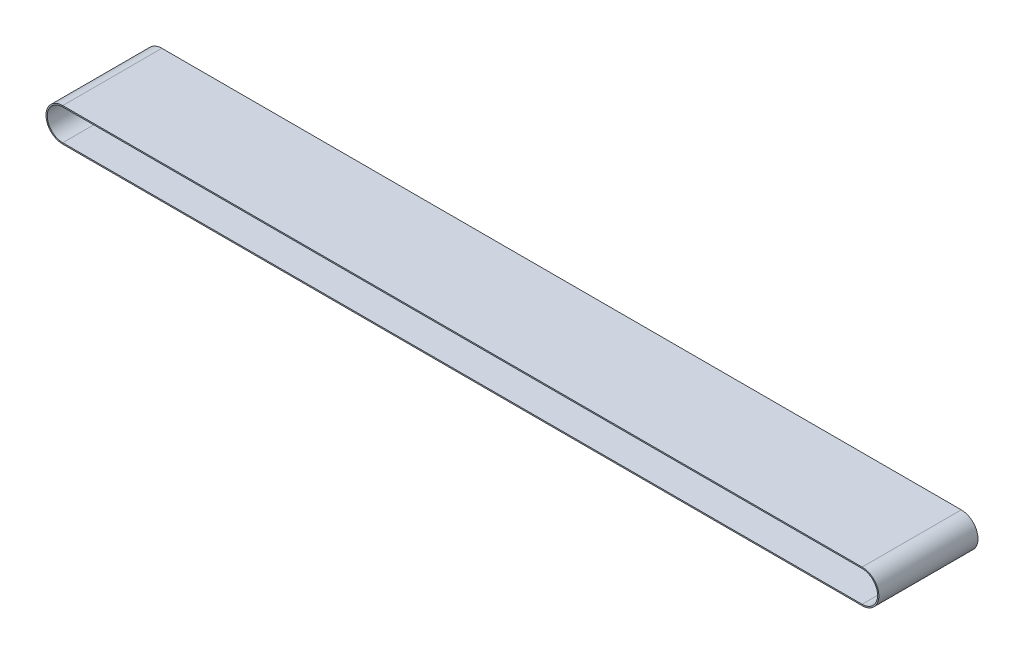
ISO-10303-21;
HEADER;
FILE_DESCRIPTION(('STEP AP214'),'2;1');
FILE_NAME('part.step','',(''),(''),'','','');
FILE_SCHEMA(('AUTOMOTIVE_DESIGN { 1 0 10303 214 1 1 1 1 }'));
ENDSEC;
DATA;
#1=APPLICATION_CONTEXT('core data for automotive mechanical design processes');
#2=APPLICATION_PROTOCOL_DEFINITION('international standard','automotive_design',2000,#1);
#3=PRODUCT_CONTEXT('',#1,'mechanical');
#4=PRODUCT('Part','Part','',(#3));
#5=PRODUCT_RELATED_PRODUCT_CATEGORY('part','',(#4));
#6=PRODUCT_DEFINITION_FORMATION('','',#4);
#7=PRODUCT_DEFINITION_CONTEXT('part definition',#1,'design');
#8=PRODUCT_DEFINITION('design','',#6,#7);
#9=PRODUCT_DEFINITION_SHAPE('','',#8);
#10=(LENGTH_UNIT() NAMED_UNIT(*) SI_UNIT(.MILLI.,.METRE.));
#11=(NAMED_UNIT(*) PLANE_ANGLE_UNIT() SI_UNIT($,.RADIAN.));
#12=(NAMED_UNIT(*) SI_UNIT($,.STERADIAN.) SOLID_ANGLE_UNIT());
#13=UNCERTAINTY_MEASURE_WITH_UNIT(LENGTH_MEASURE(1.E-05),#10,'distance_accuracy_value','');
#14=(GEOMETRIC_REPRESENTATION_CONTEXT(3) GLOBAL_UNCERTAINTY_ASSIGNED_CONTEXT((#13)) GLOBAL_UNIT_ASSIGNED_CONTEXT((#10,
#11,#12)) REPRESENTATION_CONTEXT('',''));
#15=CARTESIAN_POINT('',(0.,0.,0.));
#16=DIRECTION('',(0.,0.,1.));
#17=DIRECTION('',(1.,0.,0.));
#18=AXIS2_PLACEMENT_3D('',#15,#16,#17);
#19=CARTESIAN_POINT('',(-645.,0.,160.));
#20=DIRECTION('',(0.,0.,1.));
#21=DIRECTION('',(1.,0.,0.));
#22=AXIS2_PLACEMENT_3D('',#19,#20,#21);
#23=PLANE('',#22);
#24=CARTESIAN_POINT('',(-645.,0.,160.));
#25=DIRECTION('',(0.,0.,1.));
#26=DIRECTION('',(1.,0.,0.));
#27=AXIS2_PLACEMENT_3D('',#24,#25,#26);
#28=CIRCLE('',#27,27.);
#29=CARTESIAN_POINT('',(-645.,27.,160.));
#30=VERTEX_POINT('',#29);
#31=CARTESIAN_POINT('',(-645.,-27.,160.));
#32=VERTEX_POINT('',#31);
#33=EDGE_CURVE('E139',#30,#32,#28,.T.);
#34=ORIENTED_EDGE('',*,*,#33,.T.);
#35=DIRECTION('',(1.,0.,0.));
#36=VECTOR('',#35,1.);
#37=CARTESIAN_POINT('',(-645.,-27.,160.));
#38=LINE('',#37,#36);
#39=CARTESIAN_POINT('',(645.,-27.,160.));
#40=VERTEX_POINT('',#39);
#41=EDGE_CURVE('E143',#32,#40,#38,.T.);
#42=ORIENTED_EDGE('',*,*,#41,.T.);
#43=CARTESIAN_POINT('',(645.,0.,160.));
#44=DIRECTION('',(0.,0.,1.));
#45=DIRECTION('',(1.,0.,0.));
#46=AXIS2_PLACEMENT_3D('',#43,#44,#45);
#47=CIRCLE('',#46,27.);
#48=CARTESIAN_POINT('',(645.,27.,160.));
#49=VERTEX_POINT('',#48);
#50=EDGE_CURVE('E146',#40,#49,#47,.T.);
#51=ORIENTED_EDGE('',*,*,#50,.T.);
#52=DIRECTION('',(-1.,0.,0.));
#53=VECTOR('',#52,1.);
#54=CARTESIAN_POINT('',(-645.,27.,160.));
#55=LINE('',#54,#53);
#56=EDGE_CURVE('E148',#49,#30,#55,.T.);
#57=ORIENTED_EDGE('',*,*,#56,.T.);
#58=EDGE_LOOP('',(#34,#42,#51,#57));
#59=FACE_BOUND('',#58,.T.);
#60=DIRECTION('',(-1.,0.,0.));
#61=VECTOR('',#60,1.);
#62=CARTESIAN_POINT('',(-645.,25.,160.));
#63=LINE('',#62,#61);
#64=CARTESIAN_POINT('',(645.,25.,160.));
#65=VERTEX_POINT('',#64);
#66=CARTESIAN_POINT('',(-645.,25.,160.));
#67=VERTEX_POINT('',#66);
#68=EDGE_CURVE('E109',#65,#67,#63,.T.);
#69=ORIENTED_EDGE('',*,*,#68,.F.);
#70=CARTESIAN_POINT('',(645.,0.,160.));
#71=DIRECTION('',(0.,0.,1.));
#72=DIRECTION('',(1.,0.,0.));
#73=AXIS2_PLACEMENT_3D('',#70,#71,#72);
#74=CIRCLE('',#73,25.);
#75=CARTESIAN_POINT('',(645.,-25.,160.));
#76=VERTEX_POINT('',#75);
#77=EDGE_CURVE('E100',#76,#65,#74,.T.);
#78=ORIENTED_EDGE('',*,*,#77,.F.);
#79=DIRECTION('',(1.,0.,0.));
#80=VECTOR('',#79,1.);
#81=CARTESIAN_POINT('',(-645.,-25.,160.));
#82=LINE('',#81,#80);
#83=CARTESIAN_POINT('',(-645.,-25.,160.));
#84=VERTEX_POINT('',#83);
#85=EDGE_CURVE('E124',#84,#76,#82,.T.);
#86=ORIENTED_EDGE('',*,*,#85,.F.);
#87=CARTESIAN_POINT('',(-645.,0.,160.));
#88=DIRECTION('',(0.,0.,1.));
#89=DIRECTION('',(1.,0.,0.));
#90=AXIS2_PLACEMENT_3D('',#87,#88,#89);
#91=CIRCLE('',#90,25.);
#92=EDGE_CURVE('E121',#67,#84,#91,.T.);
#93=ORIENTED_EDGE('',*,*,#92,.F.);
#94=EDGE_LOOP('',(#69,#78,#86,#93));
#95=FACE_BOUND('',#94,.T.);
#96=ADVANCED_FACE('F35',(#59,#95),#23,.T.);
#97=CARTESIAN_POINT('',(-645.,0.,0.));
#98=DIRECTION('',(0.,0.,1.));
#99=DIRECTION('',(1.,0.,0.));
#100=AXIS2_PLACEMENT_3D('',#97,#98,#99);
#101=PLANE('',#100);
#102=CARTESIAN_POINT('',(-645.,0.,0.));
#103=DIRECTION('',(0.,0.,1.));
#104=DIRECTION('',(1.,0.,0.));
#105=AXIS2_PLACEMENT_3D('',#102,#103,#104);
#106=CIRCLE('',#105,27.);
#107=CARTESIAN_POINT('',(-645.,27.,0.));
#108=VERTEX_POINT('',#107);
#109=CARTESIAN_POINT('',(-645.,-27.,0.));
#110=VERTEX_POINT('',#109);
#111=EDGE_CURVE('E117',#108,#110,#106,.T.);
#112=ORIENTED_EDGE('',*,*,#111,.F.);
#113=DIRECTION('',(-1.,0.,0.));
#114=VECTOR('',#113,1.);
#115=CARTESIAN_POINT('',(-645.,27.,0.));
#116=LINE('',#115,#114);
#117=CARTESIAN_POINT('',(645.,27.,0.));
#118=VERTEX_POINT('',#117);
#119=EDGE_CURVE('E144',#118,#108,#116,.T.);
#120=ORIENTED_EDGE('',*,*,#119,.F.);
#121=CARTESIAN_POINT('',(645.,0.,0.));
#122=DIRECTION('',(0.,0.,1.));
#123=DIRECTION('',(1.,0.,0.));
#124=AXIS2_PLACEMENT_3D('',#121,#122,#123);
#125=CIRCLE('',#124,27.);
#126=CARTESIAN_POINT('',(645.,-27.,0.));
#127=VERTEX_POINT('',#126);
#128=EDGE_CURVE('E157',#127,#118,#125,.T.);
#129=ORIENTED_EDGE('',*,*,#128,.F.);
#130=DIRECTION('',(1.,0.,0.));
#131=VECTOR('',#130,1.);
#132=CARTESIAN_POINT('',(-645.,-27.,0.));
#133=LINE('',#132,#131);
#134=EDGE_CURVE('E155',#110,#127,#133,.T.);
#135=ORIENTED_EDGE('',*,*,#134,.F.);
#136=EDGE_LOOP('',(#112,#120,#129,#135));
#137=FACE_BOUND('',#136,.T.);
#138=CARTESIAN_POINT('',(645.,0.,0.));
#139=DIRECTION('',(0.,0.,1.));
#140=DIRECTION('',(1.,0.,0.));
#141=AXIS2_PLACEMENT_3D('',#138,#139,#140);
#142=CIRCLE('',#141,25.);
#143=CARTESIAN_POINT('',(645.,-25.,0.));
#144=VERTEX_POINT('',#143);
#145=CARTESIAN_POINT('',(645.,25.,0.));
#146=VERTEX_POINT('',#145);
#147=EDGE_CURVE('E58',#144,#146,#142,.T.);
#148=ORIENTED_EDGE('',*,*,#147,.T.);
#149=DIRECTION('',(-1.,0.,0.));
#150=VECTOR('',#149,1.);
#151=CARTESIAN_POINT('',(-645.,25.,0.));
#152=LINE('',#151,#150);
#153=CARTESIAN_POINT('',(-645.,25.,0.));
#154=VERTEX_POINT('',#153);
#155=EDGE_CURVE('E116',#146,#154,#152,.T.);
#156=ORIENTED_EDGE('',*,*,#155,.T.);
#157=CARTESIAN_POINT('',(-645.,0.,0.));
#158=DIRECTION('',(0.,0.,1.));
#159=DIRECTION('',(1.,0.,0.));
#160=AXIS2_PLACEMENT_3D('',#157,#158,#159);
#161=CIRCLE('',#160,25.);
#162=CARTESIAN_POINT('',(-645.,-25.,0.));
#163=VERTEX_POINT('',#162);
#164=EDGE_CURVE('E131',#154,#163,#161,.T.);
#165=ORIENTED_EDGE('',*,*,#164,.T.);
#166=DIRECTION('',(1.,0.,0.));
#167=VECTOR('',#166,1.);
#168=CARTESIAN_POINT('',(-645.,-25.,0.));
#169=LINE('',#168,#167);
#170=EDGE_CURVE('E110',#163,#144,#169,.T.);
#171=ORIENTED_EDGE('',*,*,#170,.T.);
#172=EDGE_LOOP('',(#148,#156,#165,#171));
#173=FACE_BOUND('',#172,.T.);
#174=ADVANCED_FACE('F176',(#137,#173),#101,.F.);
#175=CARTESIAN_POINT('',(-645.,0.,160.));
#176=DIRECTION('',(0.,0.,-1.));
#177=DIRECTION('',(-1.,0.,0.));
#178=AXIS2_PLACEMENT_3D('',#175,#176,#177);
#179=CYLINDRICAL_SURFACE('',#178,27.);
#180=ORIENTED_EDGE('',*,*,#111,.T.);
#181=DIRECTION('',(0.,0.,-1.));
#182=VECTOR('',#181,1.);
#183=CARTESIAN_POINT('',(-645.,-27.,160.));
#184=LINE('',#183,#182);
#185=EDGE_CURVE('E11',#32,#110,#184,.T.);
#186=ORIENTED_EDGE('',*,*,#185,.F.);
#187=ORIENTED_EDGE('',*,*,#33,.F.);
#188=DIRECTION('',(0.,0.,-1.));
#189=VECTOR('',#188,1.);
#190=CARTESIAN_POINT('',(-645.,27.,160.));
#191=LINE('',#190,#189);
#192=EDGE_CURVE('E151',#30,#108,#191,.T.);
#193=ORIENTED_EDGE('',*,*,#192,.T.);
#194=EDGE_LOOP('',(#180,#186,#187,#193));
#195=FACE_BOUND('',#194,.T.);
#196=ADVANCED_FACE('F37',(#195),#179,.T.);
#197=CARTESIAN_POINT('',(-645.,-27.,160.));
#198=DIRECTION('',(0.,1.,0.));
#199=DIRECTION('',(0.,0.,1.));
#200=AXIS2_PLACEMENT_3D('',#197,#198,#199);
#201=PLANE('',#200);
#202=ORIENTED_EDGE('',*,*,#134,.T.);
#203=DIRECTION('',(0.,0.,-1.));
#204=VECTOR('',#203,1.);
#205=CARTESIAN_POINT('',(645.,-27.,160.));
#206=LINE('',#205,#204);
#207=EDGE_CURVE('E43',#40,#127,#206,.T.);
#208=ORIENTED_EDGE('',*,*,#207,.F.);
#209=ORIENTED_EDGE('',*,*,#41,.F.);
#210=ORIENTED_EDGE('',*,*,#185,.T.);
#211=EDGE_LOOP('',(#202,#208,#209,#210));
#212=FACE_BOUND('',#211,.T.);
#213=ADVANCED_FACE('F186',(#212),#201,.F.);
#214=CARTESIAN_POINT('',(645.,0.,160.));
#215=DIRECTION('',(0.,0.,-1.));
#216=DIRECTION('',(-1.,0.,0.));
#217=AXIS2_PLACEMENT_3D('',#214,#215,#216);
#218=CYLINDRICAL_SURFACE('',#217,27.);
#219=ORIENTED_EDGE('',*,*,#128,.T.);
#220=DIRECTION('',(0.,0.,-1.));
#221=VECTOR('',#220,1.);
#222=CARTESIAN_POINT('',(645.,27.,160.));
#223=LINE('',#222,#221);
#224=EDGE_CURVE('E162',#49,#118,#223,.T.);
#225=ORIENTED_EDGE('',*,*,#224,.F.);
#226=ORIENTED_EDGE('',*,*,#50,.F.);
#227=ORIENTED_EDGE('',*,*,#207,.T.);
#228=EDGE_LOOP('',(#219,#225,#226,#227));
#229=FACE_BOUND('',#228,.T.);
#230=ADVANCED_FACE('F170',(#229),#218,.T.);
#231=CARTESIAN_POINT('',(-645.,27.,160.));
#232=DIRECTION('',(0.,-1.,0.));
#233=DIRECTION('',(0.,0.,-1.));
#234=AXIS2_PLACEMENT_3D('',#231,#232,#233);
#235=PLANE('',#234);
#236=ORIENTED_EDGE('',*,*,#119,.T.);
#237=ORIENTED_EDGE('',*,*,#192,.F.);
#238=ORIENTED_EDGE('',*,*,#56,.F.);
#239=ORIENTED_EDGE('',*,*,#224,.T.);
#240=EDGE_LOOP('',(#236,#237,#238,#239));
#241=FACE_BOUND('',#240,.T.);
#242=ADVANCED_FACE('F180',(#241),#235,.F.);
#243=CARTESIAN_POINT('',(645.,0.,160.));
#244=DIRECTION('',(0.,0.,-1.));
#245=DIRECTION('',(-1.,0.,0.));
#246=AXIS2_PLACEMENT_3D('',#243,#244,#245);
#247=CYLINDRICAL_SURFACE('',#246,25.);
#248=ORIENTED_EDGE('',*,*,#147,.F.);
#249=DIRECTION('',(0.,0.,-1.));
#250=VECTOR('',#249,1.);
#251=CARTESIAN_POINT('',(645.,-25.,160.));
#252=LINE('',#251,#250);
#253=EDGE_CURVE('E104',#76,#144,#252,.T.);
#254=ORIENTED_EDGE('',*,*,#253,.F.);
#255=ORIENTED_EDGE('',*,*,#77,.T.);
#256=DIRECTION('',(0.,0.,-1.));
#257=VECTOR('',#256,1.);
#258=CARTESIAN_POINT('',(645.,25.,160.));
#259=LINE('',#258,#257);
#260=EDGE_CURVE('E103',#65,#146,#259,.T.);
#261=ORIENTED_EDGE('',*,*,#260,.T.);
#262=EDGE_LOOP('',(#248,#254,#255,#261));
#263=FACE_BOUND('',#262,.T.);
#264=ADVANCED_FACE('F102',(#263),#247,.F.);
#265=CARTESIAN_POINT('',(-645.,25.,160.));
#266=DIRECTION('',(0.,-1.,0.));
#267=DIRECTION('',(0.,0.,-1.));
#268=AXIS2_PLACEMENT_3D('',#265,#266,#267);
#269=PLANE('',#268);
#270=ORIENTED_EDGE('',*,*,#155,.F.);
#271=ORIENTED_EDGE('',*,*,#260,.F.);
#272=ORIENTED_EDGE('',*,*,#68,.T.);
#273=DIRECTION('',(0.,0.,-1.));
#274=VECTOR('',#273,1.);
#275=CARTESIAN_POINT('',(-645.,25.,160.));
#276=LINE('',#275,#274);
#277=EDGE_CURVE('E118',#67,#154,#276,.T.);
#278=ORIENTED_EDGE('',*,*,#277,.T.);
#279=EDGE_LOOP('',(#270,#271,#272,#278));
#280=FACE_BOUND('',#279,.T.);
#281=ADVANCED_FACE('F113',(#280),#269,.T.);
#282=CARTESIAN_POINT('',(-645.,0.,160.));
#283=DIRECTION('',(0.,0.,-1.));
#284=DIRECTION('',(-1.,0.,0.));
#285=AXIS2_PLACEMENT_3D('',#282,#283,#284);
#286=CYLINDRICAL_SURFACE('',#285,25.);
#287=ORIENTED_EDGE('',*,*,#164,.F.);
#288=ORIENTED_EDGE('',*,*,#277,.F.);
#289=ORIENTED_EDGE('',*,*,#92,.T.);
#290=DIRECTION('',(0.,0.,-1.));
#291=VECTOR('',#290,1.);
#292=CARTESIAN_POINT('',(-645.,-25.,160.));
#293=LINE('',#292,#291);
#294=EDGE_CURVE('E50',#84,#163,#293,.T.);
#295=ORIENTED_EDGE('',*,*,#294,.T.);
#296=EDGE_LOOP('',(#287,#288,#289,#295));
#297=FACE_BOUND('',#296,.T.);
#298=ADVANCED_FACE('F209',(#297),#286,.F.);
#299=CARTESIAN_POINT('',(-645.,-25.,160.));
#300=DIRECTION('',(0.,1.,0.));
#301=DIRECTION('',(0.,0.,1.));
#302=AXIS2_PLACEMENT_3D('',#299,#300,#301);
#303=PLANE('',#302);
#304=ORIENTED_EDGE('',*,*,#170,.F.);
#305=ORIENTED_EDGE('',*,*,#294,.F.);
#306=ORIENTED_EDGE('',*,*,#85,.T.);
#307=ORIENTED_EDGE('',*,*,#253,.T.);
#308=EDGE_LOOP('',(#304,#305,#306,#307));
#309=FACE_BOUND('',#308,.T.);
#310=ADVANCED_FACE('F213',(#309),#303,.T.);
#311=CLOSED_SHELL('',(#96,#174,#196,#213,#230,#242,#264,#281,#298,#310));
#312=MANIFOLD_SOLID_BREP('B2',#311);
#313=ADVANCED_BREP_SHAPE_REPRESENTATION('',(#18,#312),#14);
#314=SHAPE_DEFINITION_REPRESENTATION(#9,#313);
ENDSEC;
END-ISO-10303-21;
